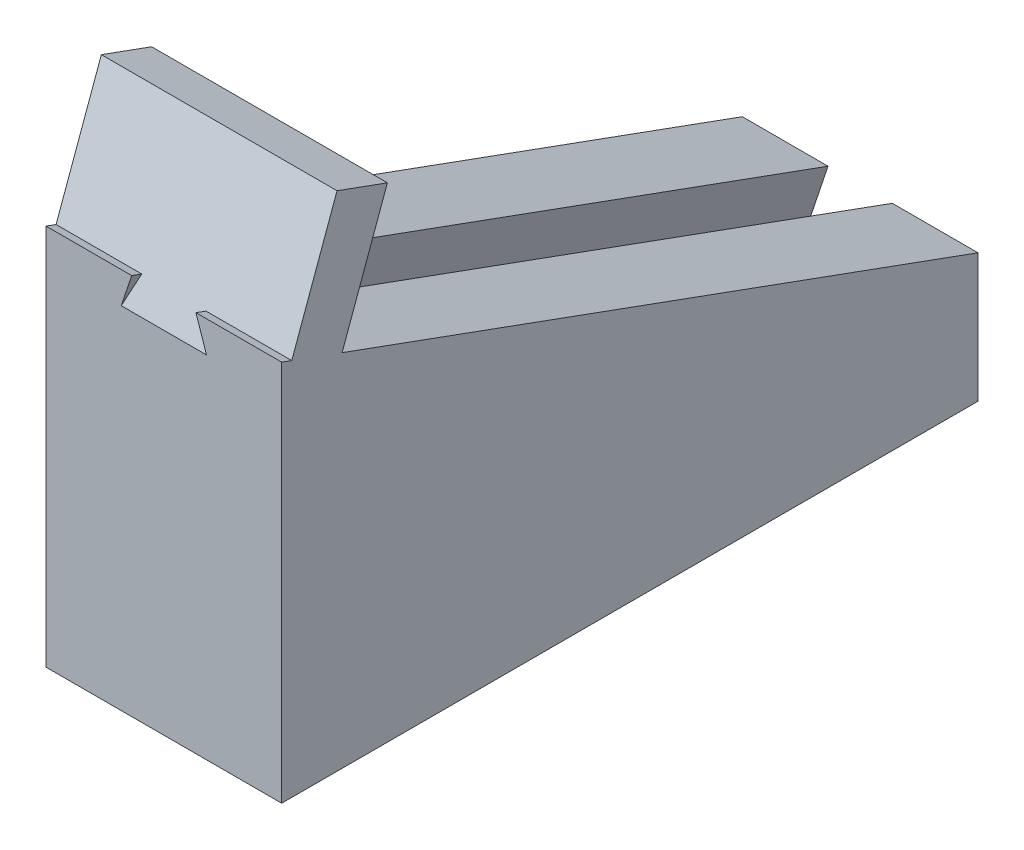
ISO-10303-21;
HEADER;
FILE_DESCRIPTION(('STEP AP214'),'2;1');
FILE_NAME('part.step','',(''),(''),'','','');
FILE_SCHEMA(('AUTOMOTIVE_DESIGN { 1 0 10303 214 1 1 1 1 }'));
ENDSEC;
DATA;
#1=APPLICATION_CONTEXT('core data for automotive mechanical design processes');
#2=APPLICATION_PROTOCOL_DEFINITION('international standard','automotive_design',2000,#1);
#3=PRODUCT_CONTEXT('',#1,'mechanical');
#4=PRODUCT('Part','Part','',(#3));
#5=PRODUCT_RELATED_PRODUCT_CATEGORY('part','',(#4));
#6=PRODUCT_DEFINITION_FORMATION('','',#4);
#7=PRODUCT_DEFINITION_CONTEXT('part definition',#1,'design');
#8=PRODUCT_DEFINITION('design','',#6,#7);
#9=PRODUCT_DEFINITION_SHAPE('','',#8);
#10=(LENGTH_UNIT() NAMED_UNIT(*) SI_UNIT(.MILLI.,.METRE.));
#11=(NAMED_UNIT(*) PLANE_ANGLE_UNIT() SI_UNIT($,.RADIAN.));
#12=(NAMED_UNIT(*) SI_UNIT($,.STERADIAN.) SOLID_ANGLE_UNIT());
#13=UNCERTAINTY_MEASURE_WITH_UNIT(LENGTH_MEASURE(1.E-05),#10,'distance_accuracy_value','');
#14=(GEOMETRIC_REPRESENTATION_CONTEXT(3) GLOBAL_UNCERTAINTY_ASSIGNED_CONTEXT((#13)) GLOBAL_UNIT_ASSIGNED_CONTEXT((#10,
#11,#12)) REPRESENTATION_CONTEXT('',''));
#15=CARTESIAN_POINT('',(0.,0.,0.));
#16=DIRECTION('',(0.,0.,1.));
#17=DIRECTION('',(1.,0.,0.));
#18=AXIS2_PLACEMENT_3D('',#15,#16,#17);
#19=CARTESIAN_POINT('',(-11.,4.71740096382081,-1.71699353392943));
#20=DIRECTION('',(0.,0.939692620785911,-0.342020143325662));
#21=DIRECTION('',(0.,0.342020143325662,0.939692620785911));
#22=AXIS2_PLACEMENT_3D('',#19,#20,#21);
#23=PLANE('',#22);
#24=DIRECTION('',(1.,0.,0.));
#25=VECTOR('',#24,1.);
#26=CARTESIAN_POINT('',(-11.,7.87507660337747,6.95864898371458));
#27=LINE('',#26,#25);
#28=CARTESIAN_POINT('',(-4.,7.8750766033774,6.95864898371461));
#29=VERTEX_POINT('',#28);
#30=CARTESIAN_POINT('',(0.,7.87507660337747,6.95864898371458));
#31=VERTEX_POINT('',#30);
#32=EDGE_CURVE('E197',#29,#31,#27,.T.);
#33=ORIENTED_EDGE('',*,*,#32,.F.);
#34=DIRECTION('',(0.,0.342020143325663,0.939692620785911));
#35=VECTOR('',#34,1.);
#36=CARTESIAN_POINT('',(-4.,-4.1473175071279,-26.0726073626836));
#37=LINE('',#36,#35);
#38=CARTESIAN_POINT('',(-4.,8.04608667504022,7.42849529410753));
#39=VERTEX_POINT('',#38);
#40=EDGE_CURVE('E200',#29,#39,#37,.T.);
#41=ORIENTED_EDGE('',*,*,#40,.T.);
#42=DIRECTION('',(1.,0.,0.));
#43=VECTOR('',#42,1.);
#44=CARTESIAN_POINT('',(-11.,8.0460866750403,7.42849529410754));
#45=LINE('',#44,#43);
#46=CARTESIAN_POINT('',(0.,8.0460866750403,7.42849529410754));
#47=VERTEX_POINT('',#46);
#48=EDGE_CURVE('E232',#39,#47,#45,.T.);
#49=ORIENTED_EDGE('',*,*,#48,.T.);
#50=DIRECTION('',(0.,0.342020143325662,0.939692620785911));
#51=VECTOR('',#50,1.);
#52=CARTESIAN_POINT('',(0.,4.71740096382081,-1.71699353392943));
#53=LINE('',#52,#51);
#54=EDGE_CURVE('E203',#31,#47,#53,.T.);
#55=ORIENTED_EDGE('',*,*,#54,.F.);
#56=EDGE_LOOP('',(#33,#41,#49,#55));
#57=FACE_BOUND('',#56,.T.);
#58=ADVANCED_FACE('F37',(#57),#23,.T.);
#59=DIRECTION('',(1.,0.,0.));
#60=VECTOR('',#59,1.);
#61=CARTESIAN_POINT('',(-11.,7.87507660337747,6.95864898371458));
#62=LINE('',#61,#60);
#63=CARTESIAN_POINT('',(-11.,7.87507660337747,6.95864898371458));
#64=VERTEX_POINT('',#63);
#65=CARTESIAN_POINT('',(-7.,7.8750766033774,6.95864898371461));
#66=VERTEX_POINT('',#65);
#67=EDGE_CURVE('E52',#64,#66,#62,.T.);
#68=ORIENTED_EDGE('',*,*,#67,.F.);
#69=DIRECTION('',(0.,0.342020143325662,0.939692620785911));
#70=VECTOR('',#69,1.);
#71=CARTESIAN_POINT('',(-11.,4.71740096382081,-1.71699353392943));
#72=LINE('',#71,#70);
#73=CARTESIAN_POINT('',(-11.,8.0460866750403,7.42849529410754));
#74=VERTEX_POINT('',#73);
#75=EDGE_CURVE('E224',#64,#74,#72,.T.);
#76=ORIENTED_EDGE('',*,*,#75,.T.);
#77=CARTESIAN_POINT('',(-7.,8.0460866750403,7.42849529410754));
#78=VERTEX_POINT('',#77);
#79=EDGE_CURVE('E254',#74,#78,#45,.T.);
#80=ORIENTED_EDGE('',*,*,#79,.T.);
#81=DIRECTION('',(0.,0.342020143325663,0.939692620785911));
#82=VECTOR('',#81,1.);
#83=CARTESIAN_POINT('',(-7.,-4.1473175071279,-26.0726073626836));
#84=LINE('',#83,#82);
#85=EDGE_CURVE('E212',#66,#78,#84,.T.);
#86=ORIENTED_EDGE('',*,*,#85,.F.);
#87=EDGE_LOOP('',(#68,#76,#80,#86));
#88=FACE_BOUND('',#87,.T.);
#89=ADVANCED_FACE('F283',(#88),#23,.T.);
#90=CARTESIAN_POINT('',(-4.,-4.1473175071279,-26.0726073626836));
#91=DIRECTION('',(-0.942461240687015,-0.314153746895672,0.114342612853221));
#92=DIRECTION('',(0.316227766016838,-0.948683298050514,0.));
#93=AXIS2_PLACEMENT_3D('',#90,#91,#92);
#94=PLANE('',#93);
#95=DIRECTION('',(-0.334315434586397,0.885623873250323,-0.322340728618655));
#96=VECTOR('',#95,1.);
#97=CARTESIAN_POINT('',(-4.,7.8750766033774,6.95864898371461));
#98=LINE('',#97,#96);
#99=CARTESIAN_POINT('',(-3.5126992666395,6.58418447495873,7.42849529410754));
#100=VERTEX_POINT('',#99);
#101=EDGE_CURVE('E194',#100,#29,#98,.T.);
#102=ORIENTED_EDGE('',*,*,#101,.F.);
#103=DIRECTION('',(0.316227766016838,-0.948683298050514,0.));
#104=VECTOR('',#103,1.);
#105=CARTESIAN_POINT('',(-2.28617399748793,2.90460866750402,7.42849529410753));
#106=LINE('',#105,#104);
#107=EDGE_CURVE('E258',#39,#100,#106,.T.);
#108=ORIENTED_EDGE('',*,*,#107,.F.);
#109=ORIENTED_EDGE('',*,*,#40,.F.);
#110=EDGE_LOOP('',(#102,#108,#109));
#111=FACE_BOUND('',#110,.T.);
#112=ADVANCED_FACE('F298',(#111),#94,.T.);
#113=CARTESIAN_POINT('',(-8.,-7.1473175071279,-26.0726073626836));
#114=DIRECTION('',(0.942461240687016,-0.314153746895672,0.114342612853221));
#115=DIRECTION('',(0.316227766016838,0.948683298050514,0.));
#116=AXIS2_PLACEMENT_3D('',#113,#114,#115);
#117=PLANE('',#116);
#118=DIRECTION('',(-0.334315434586397,-0.885623873250322,0.322340728618655));
#119=VECTOR('',#118,1.);
#120=CARTESIAN_POINT('',(-8.,5.22600993869892,7.9228303982444));
#121=LINE('',#120,#119);
#122=CARTESIAN_POINT('',(-7.4873007333605,6.58418447495873,7.42849529410754));
#123=VERTEX_POINT('',#122);
#124=EDGE_CURVE('E11',#66,#123,#121,.T.);
#125=ORIENTED_EDGE('',*,*,#124,.F.);
#126=ORIENTED_EDGE('',*,*,#85,.T.);
#127=DIRECTION('',(0.316227766016838,0.948683298050514,0.));
#128=VECTOR('',#127,1.);
#129=CARTESIAN_POINT('',(-9.81382600251207,-0.39539133249598,7.42849529410753));
#130=LINE('',#129,#128);
#131=EDGE_CURVE('E247',#123,#78,#130,.T.);
#132=ORIENTED_EDGE('',*,*,#131,.F.);
#133=EDGE_LOOP('',(#125,#126,#132));
#134=FACE_BOUND('',#133,.T.);
#135=ADVANCED_FACE('F307',(#134),#117,.T.);
#136=DIRECTION('',(-1.,0.,0.));
#137=VECTOR('',#136,1.);
#138=CARTESIAN_POINT('',(-11.,7.02002624506331,4.60941743174981));
#139=LINE('',#138,#137);
#140=CARTESIAN_POINT('',(0.,7.02002624506331,4.60941743174981));
#141=VERTEX_POINT('',#140);
#142=CARTESIAN_POINT('',(-4.,7.02002624506324,4.60941743174984));
#143=VERTEX_POINT('',#142);
#144=EDGE_CURVE('E190',#141,#143,#139,.T.);
#145=ORIENTED_EDGE('',*,*,#144,.F.);
#146=CARTESIAN_POINT('',(0.,-3.78294593861103,-25.0715047058925));
#147=VERTEX_POINT('',#146);
#148=EDGE_CURVE('E233',#147,#141,#53,.T.);
#149=ORIENTED_EDGE('',*,*,#148,.F.);
#150=DIRECTION('',(1.,0.,0.));
#151=VECTOR('',#150,1.);
#152=CARTESIAN_POINT('',(-11.,-3.78294593861103,-25.0715047058925));
#153=LINE('',#152,#151);
#154=CARTESIAN_POINT('',(-4.,-3.78294593861112,-25.0715047058925));
#155=VERTEX_POINT('',#154);
#156=EDGE_CURVE('E248',#155,#147,#153,.T.);
#157=ORIENTED_EDGE('',*,*,#156,.F.);
#158=EDGE_CURVE('E219',#155,#143,#37,.T.);
#159=ORIENTED_EDGE('',*,*,#158,.T.);
#160=EDGE_LOOP('',(#145,#149,#157,#159));
#161=FACE_BOUND('',#160,.T.);
#162=ADVANCED_FACE('F39',(#161),#23,.T.);
#163=DIRECTION('',(-1.,0.,0.));
#164=VECTOR('',#163,1.);
#165=CARTESIAN_POINT('',(-11.,7.02002624506331,4.60941743174981));
#166=LINE('',#165,#164);
#167=CARTESIAN_POINT('',(-7.,7.02002624506324,4.60941743174984));
#168=VERTEX_POINT('',#167);
#169=CARTESIAN_POINT('',(-11.,7.02002624506331,4.60941743174981));
#170=VERTEX_POINT('',#169);
#171=EDGE_CURVE('E163',#168,#170,#166,.T.);
#172=ORIENTED_EDGE('',*,*,#171,.F.);
#173=CARTESIAN_POINT('',(-7.,-3.78294593861112,-25.0715047058925));
#174=VERTEX_POINT('',#173);
#175=EDGE_CURVE('E210',#174,#168,#84,.T.);
#176=ORIENTED_EDGE('',*,*,#175,.F.);
#177=CARTESIAN_POINT('',(-11.,-3.78294593861103,-25.0715047058925));
#178=VERTEX_POINT('',#177);
#179=EDGE_CURVE('E244',#178,#174,#153,.T.);
#180=ORIENTED_EDGE('',*,*,#179,.F.);
#181=EDGE_CURVE('E60',#178,#170,#72,.T.);
#182=ORIENTED_EDGE('',*,*,#181,.T.);
#183=EDGE_LOOP('',(#172,#176,#180,#182));
#184=FACE_BOUND('',#183,.T.);
#185=ADVANCED_FACE('F270',(#184),#23,.T.);
#186=CARTESIAN_POINT('',(-11.,0.,-25.0715047058925));
#187=DIRECTION('',(0.,0.,-1.));
#188=DIRECTION('',(-1.,0.,0.));
#189=AXIS2_PLACEMENT_3D('',#186,#187,#188);
#190=PLANE('',#189);
#191=DIRECTION('',(-1.,0.,0.));
#192=VECTOR('',#191,1.);
#193=CARTESIAN_POINT('',(-3.,-6.78294593861112,-25.0715047058925));
#194=LINE('',#193,#192);
#195=CARTESIAN_POINT('',(-3.,-6.78294593861112,-25.0715047058925));
#196=VERTEX_POINT('',#195);
#197=CARTESIAN_POINT('',(-8.,-6.78294593861111,-25.0715047058925));
#198=VERTEX_POINT('',#197);
#199=EDGE_CURVE('E204',#196,#198,#194,.T.);
#200=ORIENTED_EDGE('',*,*,#199,.F.);
#201=DIRECTION('',(0.316227766016838,-0.948683298050514,0.));
#202=VECTOR('',#201,1.);
#203=CARTESIAN_POINT('',(-3.89068852944496,-4.11088035027622,-25.0715047058925));
#204=LINE('',#203,#202);
#205=EDGE_CURVE('E207',#155,#196,#204,.T.);
#206=ORIENTED_EDGE('',*,*,#205,.F.);
#207=ORIENTED_EDGE('',*,*,#156,.T.);
#208=DIRECTION('',(0.,1.,0.));
#209=VECTOR('',#208,1.);
#210=CARTESIAN_POINT('',(0.,0.,-25.0715047058925));
#211=LINE('',#210,#209);
#212=CARTESIAN_POINT('',(0.,-9.78294593861103,-25.0715047058925));
#213=VERTEX_POINT('',#212);
#214=EDGE_CURVE('E241',#213,#147,#211,.T.);
#215=ORIENTED_EDGE('',*,*,#214,.F.);
#216=DIRECTION('',(1.,0.,0.));
#217=VECTOR('',#216,1.);
#218=CARTESIAN_POINT('',(-11.,-9.78294593861103,-25.0715047058925));
#219=LINE('',#218,#217);
#220=CARTESIAN_POINT('',(-11.,-9.78294593861103,-25.0715047058925));
#221=VERTEX_POINT('',#220);
#222=EDGE_CURVE('E249',#221,#213,#219,.T.);
#223=ORIENTED_EDGE('',*,*,#222,.F.);
#224=DIRECTION('',(0.,1.,0.));
#225=VECTOR('',#224,1.);
#226=CARTESIAN_POINT('',(-11.,0.,-25.0715047058925));
#227=LINE('',#226,#225);
#228=EDGE_CURVE('E229',#221,#178,#227,.T.);
#229=ORIENTED_EDGE('',*,*,#228,.T.);
#230=ORIENTED_EDGE('',*,*,#179,.T.);
#231=DIRECTION('',(0.316227766016838,0.948683298050514,0.));
#232=VECTOR('',#231,1.);
#233=CARTESIAN_POINT('',(-8.10931147055504,-7.11088035027622,-25.0715047058925));
#234=LINE('',#233,#232);
#235=EDGE_CURVE('E201',#198,#174,#234,.T.);
#236=ORIENTED_EDGE('',*,*,#235,.F.);
#237=EDGE_LOOP('',(#200,#206,#207,#215,#223,#229,#230,#236));
#238=FACE_BOUND('',#237,.T.);
#239=ADVANCED_FACE('F269',(#238),#190,.T.);
#240=CARTESIAN_POINT('',(-11.,0.,7.42849529410753));
#241=DIRECTION('',(0.,0.,1.));
#242=DIRECTION('',(0.,-1.,0.));
#243=AXIS2_PLACEMENT_3D('',#240,#241,#242);
#244=PLANE('',#243);
#245=DIRECTION('',(1.,0.,0.));
#246=VECTOR('',#245,1.);
#247=CARTESIAN_POINT('',(-11.,-9.78294593861103,7.42849529410753));
#248=LINE('',#247,#246);
#249=CARTESIAN_POINT('',(-11.,-9.78294593861103,7.42849529410753));
#250=VERTEX_POINT('',#249);
#251=CARTESIAN_POINT('',(0.,-9.78294593861103,7.42849529410753));
#252=VERTEX_POINT('',#251);
#253=EDGE_CURVE('E251',#250,#252,#248,.T.);
#254=ORIENTED_EDGE('',*,*,#253,.T.);
#255=DIRECTION('',(0.,-1.,0.));
#256=VECTOR('',#255,1.);
#257=CARTESIAN_POINT('',(0.,0.,7.42849529410753));
#258=LINE('',#257,#256);
#259=EDGE_CURVE('E236',#47,#252,#258,.T.);
#260=ORIENTED_EDGE('',*,*,#259,.F.);
#261=ORIENTED_EDGE('',*,*,#48,.F.);
#262=ORIENTED_EDGE('',*,*,#107,.T.);
#263=DIRECTION('',(-1.,0.,0.));
#264=VECTOR('',#263,1.);
#265=CARTESIAN_POINT('',(10.5382108655261,6.58418447495873,7.42849529410754));
#266=LINE('',#265,#264);
#267=EDGE_CURVE('E171',#100,#123,#266,.T.);
#268=ORIENTED_EDGE('',*,*,#267,.T.);
#269=ORIENTED_EDGE('',*,*,#131,.T.);
#270=ORIENTED_EDGE('',*,*,#79,.F.);
#271=DIRECTION('',(0.,-1.,0.));
#272=VECTOR('',#271,1.);
#273=CARTESIAN_POINT('',(-11.,0.,7.42849529410753));
#274=LINE('',#273,#272);
#275=EDGE_CURVE('E223',#74,#250,#274,.T.);
#276=ORIENTED_EDGE('',*,*,#275,.T.);
#277=EDGE_LOOP('',(#254,#260,#261,#262,#268,#269,#270,#276));
#278=FACE_BOUND('',#277,.T.);
#279=ADVANCED_FACE('F280',(#278),#244,.T.);
#280=CARTESIAN_POINT('',(-11.,-9.78294593861103,0.));
#281=DIRECTION('',(0.,-1.,0.));
#282=DIRECTION('',(0.,0.,-1.));
#283=AXIS2_PLACEMENT_3D('',#280,#281,#282);
#284=PLANE('',#283);
#285=DIRECTION('',(0.,0.,-1.));
#286=VECTOR('',#285,1.);
#287=CARTESIAN_POINT('',(0.,-9.78294593861103,0.));
#288=LINE('',#287,#286);
#289=EDGE_CURVE('E238',#252,#213,#288,.T.);
#290=ORIENTED_EDGE('',*,*,#289,.F.);
#291=ORIENTED_EDGE('',*,*,#253,.F.);
#292=DIRECTION('',(0.,0.,-1.));
#293=VECTOR('',#292,1.);
#294=CARTESIAN_POINT('',(-11.,-9.78294593861103,0.));
#295=LINE('',#294,#293);
#296=EDGE_CURVE('E226',#250,#221,#295,.T.);
#297=ORIENTED_EDGE('',*,*,#296,.T.);
#298=ORIENTED_EDGE('',*,*,#222,.T.);
#299=EDGE_LOOP('',(#290,#291,#297,#298));
#300=FACE_BOUND('',#299,.T.);
#301=ADVANCED_FACE('F276',(#300),#284,.T.);
#302=CARTESIAN_POINT('',(-11.,0.,0.));
#303=DIRECTION('',(1.,0.,0.));
#304=DIRECTION('',(0.,0.,-1.));
#305=AXIS2_PLACEMENT_3D('',#302,#303,#304);
#306=PLANE('',#305);
#307=ORIENTED_EDGE('',*,*,#296,.F.);
#308=ORIENTED_EDGE('',*,*,#275,.F.);
#309=ORIENTED_EDGE('',*,*,#75,.F.);
#310=DIRECTION('',(0.,0.939692620785911,-0.342020143325662));
#311=VECTOR('',#310,1.);
#312=CARTESIAN_POINT('',(-11.,13.6832435257722,4.8446491083134));
#313=LINE('',#312,#311);
#314=CARTESIAN_POINT('',(-11.,13.6832435257722,4.8446491083134));
#315=VERTEX_POINT('',#314);
#316=EDGE_CURVE('E165',#64,#315,#313,.T.);
#317=ORIENTED_EDGE('',*,*,#316,.T.);
#318=DIRECTION('',(0.,-0.342020143325663,-0.93969262078591));
#319=VECTOR('',#318,1.);
#320=CARTESIAN_POINT('',(-11.,12.8281931674581,2.49541755634862));
#321=LINE('',#320,#319);
#322=CARTESIAN_POINT('',(-11.,12.8281931674581,2.49541755634862));
#323=VERTEX_POINT('',#322);
#324=EDGE_CURVE('E152',#315,#323,#321,.T.);
#325=ORIENTED_EDGE('',*,*,#324,.T.);
#326=DIRECTION('',(0.,-0.939692620785911,0.342020143325663));
#327=VECTOR('',#326,1.);
#328=CARTESIAN_POINT('',(-11.,4.37095958038487,5.57359884627959));
#329=LINE('',#328,#327);
#330=EDGE_CURVE('E160',#323,#170,#329,.T.);
#331=ORIENTED_EDGE('',*,*,#330,.T.);
#332=ORIENTED_EDGE('',*,*,#181,.F.);
#333=ORIENTED_EDGE('',*,*,#228,.F.);
#334=EDGE_LOOP('',(#307,#308,#309,#317,#325,#331,#332,#333));
#335=FACE_BOUND('',#334,.T.);
#336=ADVANCED_FACE('F168',(#335),#306,.F.);
#337=CARTESIAN_POINT('',(0.,0.,0.));
#338=DIRECTION('',(1.,0.,0.));
#339=DIRECTION('',(0.,0.,-1.));
#340=AXIS2_PLACEMENT_3D('',#337,#338,#339);
#341=PLANE('',#340);
#342=ORIENTED_EDGE('',*,*,#259,.T.);
#343=ORIENTED_EDGE('',*,*,#289,.T.);
#344=ORIENTED_EDGE('',*,*,#214,.T.);
#345=ORIENTED_EDGE('',*,*,#148,.T.);
#346=DIRECTION('',(0.,-0.939692620785911,0.342020143325663));
#347=VECTOR('',#346,1.);
#348=CARTESIAN_POINT('',(0.,4.37095958038487,5.57359884627959));
#349=LINE('',#348,#347);
#350=CARTESIAN_POINT('',(0.,12.8281931674581,2.49541755634862));
#351=VERTEX_POINT('',#350);
#352=EDGE_CURVE('E157',#351,#141,#349,.T.);
#353=ORIENTED_EDGE('',*,*,#352,.F.);
#354=DIRECTION('',(0.,-0.342020143325663,-0.939692620785911));
#355=VECTOR('',#354,1.);
#356=CARTESIAN_POINT('',(0.,12.8281931674581,2.49541755634862));
#357=LINE('',#356,#355);
#358=CARTESIAN_POINT('',(0.,13.6832435257722,4.8446491083134));
#359=VERTEX_POINT('',#358);
#360=EDGE_CURVE('E154',#359,#351,#357,.T.);
#361=ORIENTED_EDGE('',*,*,#360,.F.);
#362=DIRECTION('',(0.,0.939692620785911,-0.342020143325662));
#363=VECTOR('',#362,1.);
#364=CARTESIAN_POINT('',(0.,13.6832435257722,4.8446491083134));
#365=LINE('',#364,#363);
#366=EDGE_CURVE('E174',#31,#359,#365,.T.);
#367=ORIENTED_EDGE('',*,*,#366,.F.);
#368=ORIENTED_EDGE('',*,*,#54,.T.);
#369=EDGE_LOOP('',(#342,#343,#344,#345,#353,#361,#367,#368));
#370=FACE_BOUND('',#369,.T.);
#371=ADVANCED_FACE('F290',(#370),#341,.T.);
#372=DIRECTION('',(0.334315434586397,-0.885623873250322,0.322340728618655));
#373=VECTOR('',#372,1.);
#374=CARTESIAN_POINT('',(-4.,7.02002624506324,4.60941743174984));
#375=LINE('',#374,#373);
#376=CARTESIAN_POINT('',(-3.,4.37095958038477,5.57359884627964));
#377=VERTEX_POINT('',#376);
#378=EDGE_CURVE('E187',#143,#377,#375,.T.);
#379=ORIENTED_EDGE('',*,*,#378,.F.);
#380=ORIENTED_EDGE('',*,*,#158,.F.);
#381=ORIENTED_EDGE('',*,*,#205,.T.);
#382=DIRECTION('',(0.,0.342020143325663,0.939692620785911));
#383=VECTOR('',#382,1.);
#384=CARTESIAN_POINT('',(-3.,-7.1473175071279,-26.0726073626836));
#385=LINE('',#384,#383);
#386=EDGE_CURVE('E216',#196,#377,#385,.T.);
#387=ORIENTED_EDGE('',*,*,#386,.T.);
#388=EDGE_LOOP('',(#379,#380,#381,#387));
#389=FACE_BOUND('',#388,.T.);
#390=ADVANCED_FACE('F295',(#389),#94,.T.);
#391=CARTESIAN_POINT('',(-3.,-7.1473175071279,-26.0726073626836));
#392=DIRECTION('',(0.,0.939692620785911,-0.342020143325663));
#393=DIRECTION('',(0.,0.342020143325663,0.939692620785911));
#394=AXIS2_PLACEMENT_3D('',#391,#392,#393);
#395=PLANE('',#394);
#396=DIRECTION('',(-1.,0.,0.));
#397=VECTOR('',#396,1.);
#398=CARTESIAN_POINT('',(10.5382108655261,4.37095958038487,5.57359884627959));
#399=LINE('',#398,#397);
#400=CARTESIAN_POINT('',(-8.,4.37095958038477,5.57359884627963));
#401=VERTEX_POINT('',#400);
#402=EDGE_CURVE('E179',#377,#401,#399,.T.);
#403=ORIENTED_EDGE('',*,*,#402,.F.);
#404=ORIENTED_EDGE('',*,*,#386,.F.);
#405=ORIENTED_EDGE('',*,*,#199,.T.);
#406=DIRECTION('',(0.,0.342020143325663,0.939692620785911));
#407=VECTOR('',#406,1.);
#408=CARTESIAN_POINT('',(-8.,-7.1473175071279,-26.0726073626836));
#409=LINE('',#408,#407);
#410=EDGE_CURVE('E213',#198,#401,#409,.T.);
#411=ORIENTED_EDGE('',*,*,#410,.T.);
#412=EDGE_LOOP('',(#403,#404,#405,#411));
#413=FACE_BOUND('',#412,.T.);
#414=ADVANCED_FACE('F264',(#413),#395,.T.);
#415=DIRECTION('',(0.334315434586397,0.885623873250323,-0.322340728618655));
#416=VECTOR('',#415,1.);
#417=CARTESIAN_POINT('',(-8.,4.37095958038477,5.57359884627963));
#418=LINE('',#417,#416);
#419=EDGE_CURVE('E45',#401,#168,#418,.T.);
#420=ORIENTED_EDGE('',*,*,#419,.F.);
#421=ORIENTED_EDGE('',*,*,#410,.F.);
#422=ORIENTED_EDGE('',*,*,#235,.T.);
#423=ORIENTED_EDGE('',*,*,#175,.T.);
#424=EDGE_LOOP('',(#420,#421,#422,#423));
#425=FACE_BOUND('',#424,.T.);
#426=ADVANCED_FACE('F261',(#425),#117,.T.);
#427=CARTESIAN_POINT('',(10.5382108655261,13.6832435257722,4.8446491083134));
#428=DIRECTION('',(0.,0.342020143325662,0.939692620785911));
#429=DIRECTION('',(0.,-0.939692620785911,0.342020143325662));
#430=AXIS2_PLACEMENT_3D('',#427,#428,#429);
#431=PLANE('',#430);
#432=ORIENTED_EDGE('',*,*,#101,.T.);
#433=ORIENTED_EDGE('',*,*,#32,.T.);
#434=ORIENTED_EDGE('',*,*,#366,.T.);
#435=DIRECTION('',(-1.,0.,0.));
#436=VECTOR('',#435,1.);
#437=CARTESIAN_POINT('',(10.5382108655261,13.6832435257722,4.8446491083134));
#438=LINE('',#437,#436);
#439=EDGE_CURVE('E181',#359,#315,#438,.T.);
#440=ORIENTED_EDGE('',*,*,#439,.T.);
#441=ORIENTED_EDGE('',*,*,#316,.F.);
#442=ORIENTED_EDGE('',*,*,#67,.T.);
#443=ORIENTED_EDGE('',*,*,#124,.T.);
#444=ORIENTED_EDGE('',*,*,#267,.F.);
#445=EDGE_LOOP('',(#432,#433,#434,#440,#441,#442,#443,#444));
#446=FACE_BOUND('',#445,.T.);
#447=ADVANCED_FACE('F286',(#446),#431,.T.);
#448=CARTESIAN_POINT('',(10.5382108655261,12.8281931674581,2.49541755634862));
#449=DIRECTION('',(0.,0.93969262078591,-0.342020143325663));
#450=DIRECTION('',(0.,0.342020143325663,0.939692620785911));
#451=AXIS2_PLACEMENT_3D('',#448,#449,#450);
#452=PLANE('',#451);
#453=ORIENTED_EDGE('',*,*,#439,.F.);
#454=ORIENTED_EDGE('',*,*,#360,.T.);
#455=DIRECTION('',(-1.,0.,0.));
#456=VECTOR('',#455,1.);
#457=CARTESIAN_POINT('',(10.5382108655261,12.8281931674581,2.49541755634862));
#458=LINE('',#457,#456);
#459=EDGE_CURVE('E147',#351,#323,#458,.T.);
#460=ORIENTED_EDGE('',*,*,#459,.T.);
#461=ORIENTED_EDGE('',*,*,#324,.F.);
#462=EDGE_LOOP('',(#453,#454,#460,#461));
#463=FACE_BOUND('',#462,.T.);
#464=ADVANCED_FACE('F150',(#463),#452,.T.);
#465=CARTESIAN_POINT('',(10.5382108655261,4.37095958038487,5.57359884627959));
#466=DIRECTION('',(0.,-0.342020143325663,-0.939692620785911));
#467=DIRECTION('',(0.,0.939692620785911,-0.342020143325663));
#468=AXIS2_PLACEMENT_3D('',#465,#466,#467);
#469=PLANE('',#468);
#470=ORIENTED_EDGE('',*,*,#352,.T.);
#471=ORIENTED_EDGE('',*,*,#144,.T.);
#472=ORIENTED_EDGE('',*,*,#378,.T.);
#473=ORIENTED_EDGE('',*,*,#402,.T.);
#474=ORIENTED_EDGE('',*,*,#419,.T.);
#475=ORIENTED_EDGE('',*,*,#171,.T.);
#476=ORIENTED_EDGE('',*,*,#330,.F.);
#477=ORIENTED_EDGE('',*,*,#459,.F.);
#478=EDGE_LOOP('',(#470,#471,#472,#473,#474,#475,#476,#477));
#479=FACE_BOUND('',#478,.T.);
#480=ADVANCED_FACE('F161',(#479),#469,.T.);
#481=CLOSED_SHELL('',(#58,#89,#112,#135,#162,#185,#239,#279,#301,#336,#371,#390,#414,#426,#447,
#464,#480));
#482=MANIFOLD_SOLID_BREP('B2',#481);
#483=ADVANCED_BREP_SHAPE_REPRESENTATION('',(#18,#482),#14);
#484=SHAPE_DEFINITION_REPRESENTATION(#9,#483);
ENDSEC;
END-ISO-10303-21;
